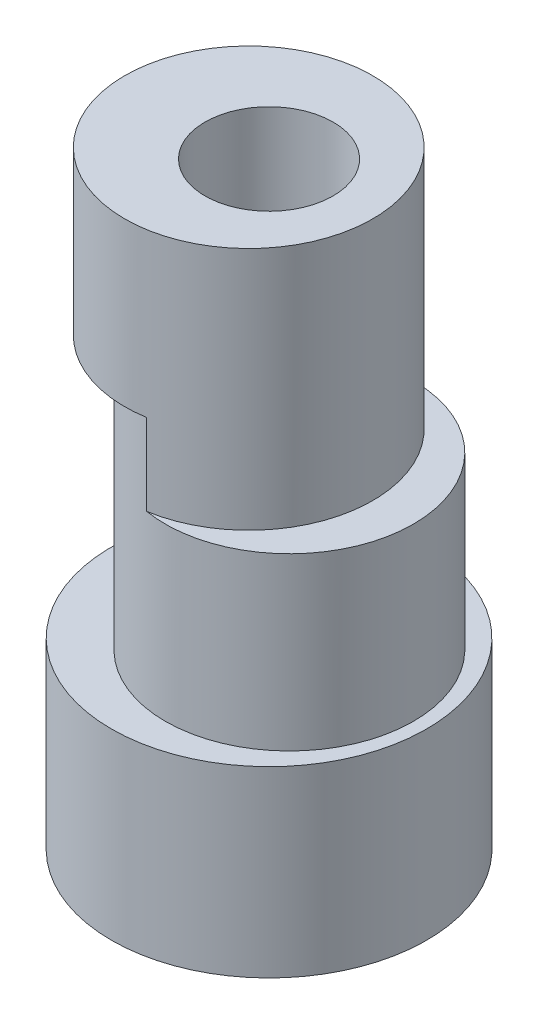
ISO-10303-21;
HEADER;
FILE_DESCRIPTION(('STEP AP214'),'2;1');
FILE_NAME('part.step','',(''),(''),'','','');
FILE_SCHEMA(('AUTOMOTIVE_DESIGN { 1 0 10303 214 1 1 1 1 }'));
ENDSEC;
DATA;
#1=APPLICATION_CONTEXT('core data for automotive mechanical design processes');
#2=APPLICATION_PROTOCOL_DEFINITION('international standard','automotive_design',2000,#1);
#3=PRODUCT_CONTEXT('',#1,'mechanical');
#4=PRODUCT('Part','Part','',(#3));
#5=PRODUCT_RELATED_PRODUCT_CATEGORY('part','',(#4));
#6=PRODUCT_DEFINITION_FORMATION('','',#4);
#7=PRODUCT_DEFINITION_CONTEXT('part definition',#1,'design');
#8=PRODUCT_DEFINITION('design','',#6,#7);
#9=PRODUCT_DEFINITION_SHAPE('','',#8);
#10=(LENGTH_UNIT() NAMED_UNIT(*) SI_UNIT(.MILLI.,.METRE.));
#11=(NAMED_UNIT(*) PLANE_ANGLE_UNIT() SI_UNIT($,.RADIAN.));
#12=(NAMED_UNIT(*) SI_UNIT($,.STERADIAN.) SOLID_ANGLE_UNIT());
#13=UNCERTAINTY_MEASURE_WITH_UNIT(LENGTH_MEASURE(1.E-05),#10,'distance_accuracy_value','');
#14=(GEOMETRIC_REPRESENTATION_CONTEXT(3) GLOBAL_UNCERTAINTY_ASSIGNED_CONTEXT((#13)) GLOBAL_UNIT_ASSIGNED_CONTEXT((#10,
#11,#12)) REPRESENTATION_CONTEXT('',''));
#15=CARTESIAN_POINT('',(0.,0.,0.));
#16=DIRECTION('',(0.,0.,1.));
#17=DIRECTION('',(1.,0.,0.));
#18=AXIS2_PLACEMENT_3D('',#15,#16,#17);
#19=CARTESIAN_POINT('',(-7.75,5.5,0.));
#20=DIRECTION('',(1.,0.,0.));
#21=DIRECTION('',(0.,0.,-1.));
#22=AXIS2_PLACEMENT_3D('',#19,#20,#21);
#23=CYLINDRICAL_SURFACE('',#22,1.5);
#24=CARTESIAN_POINT('',(-7.75,4.,0.));
#25=CARTESIAN_POINT('',(-7.74999847408196,4.00000313268231,-0.0834210787139819));
#26=CARTESIAN_POINT('',(-7.74863921449565,4.00698259134368,-0.166882359307396));
#27=CARTESIAN_POINT('',(-7.74334791734644,4.03469604662711,-0.331449592125704));
#28=CARTESIAN_POINT('',(-7.73941376913806,4.05544132733654,-0.412553555037757));
#29=CARTESIAN_POINT('',(-7.72941240772484,4.11002461966262,-0.570002657544576));
#30=CARTESIAN_POINT('',(-7.7233471771437,4.14385046488491,-0.64635214294661));
#31=CARTESIAN_POINT('',(-7.70974455178129,4.22359938098148,-0.792285992836983));
#32=CARTESIAN_POINT('',(-7.70220726111347,4.26952159640356,-0.861870835242917));
#33=CARTESIAN_POINT('',(-7.6863840905269,4.37277953275531,-0.993191675954351));
#34=CARTESIAN_POINT('',(-7.67809065789604,4.43023936977716,-1.05482918133122));
#35=CARTESIAN_POINT('',(-7.66174545065496,4.5546745695062,-1.16765325234664));
#36=CARTESIAN_POINT('',(-7.65369369415063,4.62165064300631,-1.2188390366218));
#37=CARTESIAN_POINT('',(-7.63866991902306,4.76391909131572,-1.30972091001982));
#38=CARTESIAN_POINT('',(-7.63170762900968,4.83927713328043,-1.3493159525154));
#39=CARTESIAN_POINT('',(-7.61975791069809,4.99573312434035,-1.41524529666488));
#40=CARTESIAN_POINT('',(-7.6147703003598,5.07683054352593,-1.44158082073674));
#41=CARTESIAN_POINT('',(-7.60741086759107,5.2414065627842,-1.47992571756973));
#42=CARTESIAN_POINT('',(-7.60500761838759,5.32484359253925,-1.49210735695917));
#43=CARTESIAN_POINT('',(-7.60299433869807,5.49260914317183,-1.50233357526115));
#44=CARTESIAN_POINT('',(-7.60338404106004,5.57693757801401,-1.50037950628534));
#45=CARTESIAN_POINT('',(-7.60688404856427,5.74283827920022,-1.48252926887088));
#46=CARTESIAN_POINT('',(-7.60995597992223,5.82443263325195,-1.46682974359291));
#47=CARTESIAN_POINT('',(-7.61841397136506,5.98380703500602,-1.42224426701012));
#48=CARTESIAN_POINT('',(-7.62380013560523,6.06158691085687,-1.39335772220132));
#49=CARTESIAN_POINT('',(-7.63631940233068,6.21169570851465,-1.32302804854628));
#50=CARTESIAN_POINT('',(-7.64346339941792,6.2839868086337,-1.28150621416483));
#51=CARTESIAN_POINT('',(-7.65868628007988,6.42064946100456,-1.18714021425914));
#52=CARTESIAN_POINT('',(-7.66676526448826,6.4850201575334,-1.13429482702252));
#53=CARTESIAN_POINT('',(-7.68311457012869,6.60515020881271,-1.01772509823794));
#54=CARTESIAN_POINT('',(-7.6913858240859,6.66074652086933,-0.953832732873424));
#55=CARTESIAN_POINT('',(-7.70706304694415,6.76045723589527,-0.817543107605094));
#56=CARTESIAN_POINT('',(-7.71446900605523,6.8045715089638,-0.745145751494432));
#57=CARTESIAN_POINT('',(-7.72759765137465,6.88009284102279,-0.593725914754121));
#58=CARTESIAN_POINT('',(-7.73331798232966,6.91148214275484,-0.514694360575272));
#59=CARTESIAN_POINT('',(-7.74241280644494,6.96049338712995,-0.352344598280828));
#60=CARTESIAN_POINT('',(-7.74578756541723,6.97811688981069,-0.269026877044974));
#61=CARTESIAN_POINT('',(-7.74977424845929,6.99886747844731,-0.101871802484301));
#62=CARTESIAN_POINT('',(-7.75042872018128,7.00221782981256,-0.0180631478958446));
#63=CARTESIAN_POINT('',(-7.74901892693282,6.99492703916325,0.148916632529927));
#64=CARTESIAN_POINT('',(-7.74695480467765,6.98428663160754,0.23208779160267));
#65=CARTESIAN_POINT('',(-7.7403663072359,6.94950192764545,0.394717725412862));
#66=CARTESIAN_POINT('',(-7.73586266070818,6.92547135890025,0.474201738407224));
#67=CARTESIAN_POINT('',(-7.72489811710861,6.8647121166184,0.628012475405679));
#68=CARTESIAN_POINT('',(-7.71843708048053,6.82798253765271,0.702338831219205));
#69=CARTESIAN_POINT('',(-7.7041683619824,6.74237905772412,0.844671894023758));
#70=CARTESIAN_POINT('',(-7.69634597748223,6.69336968781137,0.912595621279698));
#71=CARTESIAN_POINT('',(-7.68025855618537,6.58478021538908,1.03933496632102));
#72=CARTESIAN_POINT('',(-7.67199347520694,6.52519905642197,1.09814967272472));
#73=CARTESIAN_POINT('',(-7.65580995071658,6.39614381719799,1.20585617272696));
#74=CARTESIAN_POINT('',(-7.64789809799975,6.32654124358649,1.25459516224029));
#75=CARTESIAN_POINT('',(-7.63345275472628,6.18000576141992,1.33969011925474));
#76=CARTESIAN_POINT('',(-7.62691921097647,6.10307313592041,1.37604656466947));
#77=CARTESIAN_POINT('',(-7.61602267841533,5.94443709141718,1.43513157210702));
#78=CARTESIAN_POINT('',(-7.61164885180106,5.8627598406082,1.45792829947187));
#79=CARTESIAN_POINT('',(-7.60554305407608,5.69664116073561,1.48945537425568));
#80=CARTESIAN_POINT('',(-7.60381076295927,5.61220006776103,1.49818742553264));
#81=CARTESIAN_POINT('',(-7.60320113886837,5.4444829476079,1.50127736967434));
#82=CARTESIAN_POINT('',(-7.60427589307599,5.36121144422073,1.49587649128859));
#83=CARTESIAN_POINT('',(-7.60905263452398,5.19678756933644,1.47138405136503));
#84=CARTESIAN_POINT('',(-7.61275460356229,5.11563518316155,1.45229258467931));
#85=CARTESIAN_POINT('',(-7.62234788207545,4.95789423128806,1.40106548612556));
#86=CARTESIAN_POINT('',(-7.62823452797357,4.88129634442607,1.36895762664975));
#87=CARTESIAN_POINT('',(-7.64153687010842,4.73453656211829,1.29263615483108));
#88=CARTESIAN_POINT('',(-7.64895268405886,4.66437516274748,1.24842161044272));
#89=CARTESIAN_POINT('',(-7.66462550473274,4.53127502094128,1.14831022070382));
#90=CARTESIAN_POINT('',(-7.67289403231619,4.46846917952908,1.09223845338799));
#91=CARTESIAN_POINT('',(-7.68925611889744,4.35307786661671,0.970367356758541));
#92=CARTESIAN_POINT('',(-7.69734963727052,4.30049474594495,0.904565796081145));
#93=CARTESIAN_POINT('',(-7.71254202408635,4.20656295006088,0.764337841919684));
#94=CARTESIAN_POINT('',(-7.71963049375684,4.16532808104767,0.689834048073538));
#95=CARTESIAN_POINT('',(-7.73191220790458,4.09602775902319,0.534840677982818));
#96=CARTESIAN_POINT('',(-7.73710719743173,4.06795017327669,0.454356695930213));
#97=CARTESIAN_POINT('',(-7.74398117253215,4.03133747033662,0.311385193383974));
#98=CARTESIAN_POINT('',(-7.74622526720601,4.01960641323065,0.249723311606212));
#99=CARTESIAN_POINT('',(-7.74923523343163,4.00393661131544,0.125381838034376));
#100=CARTESIAN_POINT('',(-7.75000114693474,3.9999976453636,0.0627022751733915));
#101=CARTESIAN_POINT('',(-7.75,4.,0.));
#102=B_SPLINE_CURVE_WITH_KNOTS('',3,(#24,#25,#26,#27,#28,#29,#30,#31,#32,#33,#34,#35,#36,#37,
#38,#39,#40,#41,#42,#43,#44,#45,#46,#47,#48,#49,#50,#51,#52,#53,#54,#55,#56,#57,#58,#59,#60,#61,
#62,#63,#64,#65,#66,#67,#68,#69,#70,#71,#72,#73,#74,#75,#76,#77,#78,#79,#80,#81,#82,#83,#84,#85,
#86,#87,#88,#89,#90,#91,#92,#93,#94,#95,#96,#97,#98,#99,#100,#101),.UNSPECIFIED.,.T.,.F.,(4,2,2,
2,2,2,2,2,2,2,2,2,2,2,2,2,2,2,2,2,2,2,2,2,2,2,2,2,2,2,2,2,2,2,2,2,2,2,4),(0.,0.250033893279061,
0.500272997362749,0.750279908627459,1.00026914421188,1.25310753798955,1.5059648268747,
1.76096497917487,2.01594161826314,2.26778131268177,2.51959691839715,2.76786784168443,
3.01614993992392,3.26601139971541,3.51589983096031,3.76999112259671,4.02408528874255,
4.27853282397684,4.53295151923209,4.78337555478589,5.03378644460482,5.28210222477901,
5.53043571331732,5.78163969279568,6.03286878968402,6.28766619193877,6.54245375898111,
6.79594942792411,7.04941438495324,7.29858139147461,7.54774667171633,7.79638309590845,
8.04503866701402,8.2976563623792,8.55033208145762,8.80545637409624,9.06034494357577,
9.24828472065447,9.4362191638521),.UNSPECIFIED.);
#103=CARTESIAN_POINT('',(-7.75,4.,0.));
#104=VERTEX_POINT('',#103);
#105=EDGE_CURVE('E141',#104,#104,#102,.T.);
#106=ORIENTED_EDGE('',*,*,#105,.F.);
#107=EDGE_LOOP('',(#106));
#108=FACE_BOUND('',#107,.T.);
#109=CARTESIAN_POINT('',(-5.5,5.5,0.));
#110=DIRECTION('',(1.,0.,0.));
#111=DIRECTION('',(0.,0.,-1.));
#112=AXIS2_PLACEMENT_3D('',#109,#110,#111);
#113=CIRCLE('',#112,1.5);
#114=CARTESIAN_POINT('',(-5.5,5.5,-1.5));
#115=VERTEX_POINT('',#114);
#116=EDGE_CURVE('E115',#115,#115,#113,.T.);
#117=ORIENTED_EDGE('',*,*,#116,.T.);
#118=EDGE_LOOP('',(#117));
#119=FACE_BOUND('',#118,.T.);
#120=ADVANCED_FACE('F33',(#108,#119),#23,.F.);
#121=CARTESIAN_POINT('',(0.,9.,0.));
#122=DIRECTION('',(0.,-1.,0.));
#123=DIRECTION('',(0.,0.,-1.));
#124=AXIS2_PLACEMENT_3D('',#121,#122,#123);
#125=CYLINDRICAL_SURFACE('',#124,7.75);
#126=ORIENTED_EDGE('',*,*,#105,.T.);
#127=EDGE_LOOP('',(#126));
#128=FACE_BOUND('',#127,.T.);
#129=CARTESIAN_POINT('',(0.,9.,0.));
#130=DIRECTION('',(0.,1.,0.));
#131=DIRECTION('',(0.,0.,1.));
#132=AXIS2_PLACEMENT_3D('',#129,#130,#131);
#133=CIRCLE('',#132,7.75);
#134=CARTESIAN_POINT('',(0.,9.,7.75));
#135=VERTEX_POINT('',#134);
#136=EDGE_CURVE('E203',#135,#135,#133,.T.);
#137=ORIENTED_EDGE('',*,*,#136,.F.);
#138=EDGE_LOOP('',(#137));
#139=FACE_BOUND('',#138,.T.);
#140=CARTESIAN_POINT('',(0.,0.,0.));
#141=DIRECTION('',(0.,1.,0.));
#142=DIRECTION('',(0.,0.,1.));
#143=AXIS2_PLACEMENT_3D('',#140,#141,#142);
#144=CIRCLE('',#143,7.75);
#145=CARTESIAN_POINT('',(0.,0.,7.75));
#146=VERTEX_POINT('',#145);
#147=EDGE_CURVE('E201',#146,#146,#144,.T.);
#148=ORIENTED_EDGE('',*,*,#147,.T.);
#149=EDGE_LOOP('',(#148));
#150=FACE_BOUND('',#149,.T.);
#151=ADVANCED_FACE('F35',(#128,#139,#150),#125,.T.);
#152=CARTESIAN_POINT('',(0.,9.,0.));
#153=DIRECTION('',(0.,1.,0.));
#154=DIRECTION('',(0.,0.,1.));
#155=AXIS2_PLACEMENT_3D('',#152,#153,#154);
#156=PLANE('',#155);
#157=CARTESIAN_POINT('',(1.,9.,0.));
#158=DIRECTION('',(0.,1.,0.));
#159=DIRECTION('',(0.,0.,1.));
#160=AXIS2_PLACEMENT_3D('',#157,#158,#159);
#161=CIRCLE('',#160,6.1);
#162=CARTESIAN_POINT('',(1.,9.,6.1));
#163=VERTEX_POINT('',#162);
#164=EDGE_CURVE('E206',#163,#163,#161,.T.);
#165=ORIENTED_EDGE('',*,*,#164,.F.);
#166=EDGE_LOOP('',(#165));
#167=FACE_BOUND('',#166,.T.);
#168=ORIENTED_EDGE('',*,*,#136,.T.);
#169=EDGE_LOOP('',(#168));
#170=FACE_BOUND('',#169,.T.);
#171=ADVANCED_FACE('F189',(#167,#170),#156,.T.);
#172=CARTESIAN_POINT('',(0.,0.,0.));
#173=DIRECTION('',(0.,1.,0.));
#174=DIRECTION('',(0.,0.,1.));
#175=AXIS2_PLACEMENT_3D('',#172,#173,#174);
#176=PLANE('',#175);
#177=CARTESIAN_POINT('',(0.,0.,0.));
#178=DIRECTION('',(0.,-1.,0.));
#179=DIRECTION('',(0.,0.,-1.));
#180=AXIS2_PLACEMENT_3D('',#177,#178,#179);
#181=CIRCLE('',#180,3.15);
#182=CARTESIAN_POINT('',(0.,0.,-3.15));
#183=VERTEX_POINT('',#182);
#184=EDGE_CURVE('E161',#183,#183,#181,.T.);
#185=ORIENTED_EDGE('',*,*,#184,.F.);
#186=EDGE_LOOP('',(#185));
#187=FACE_BOUND('',#186,.T.);
#188=ORIENTED_EDGE('',*,*,#147,.F.);
#189=EDGE_LOOP('',(#188));
#190=FACE_BOUND('',#189,.T.);
#191=ADVANCED_FACE('F188',(#187,#190),#176,.F.);
#192=CARTESIAN_POINT('',(1.,21.4,0.));
#193=DIRECTION('',(0.,-1.,0.));
#194=DIRECTION('',(0.,0.,-1.));
#195=AXIS2_PLACEMENT_3D('',#192,#193,#194);
#196=CYLINDRICAL_SURFACE('',#195,6.1);
#197=CARTESIAN_POINT('',(1.,21.4,0.));
#198=DIRECTION('',(0.,1.,0.));
#199=DIRECTION('',(0.,0.,1.));
#200=AXIS2_PLACEMENT_3D('',#197,#198,#199);
#201=CIRCLE('',#200,6.1);
#202=CARTESIAN_POINT('',(0.,21.4,-6.01747455333215));
#203=VERTEX_POINT('',#202);
#204=CARTESIAN_POINT('',(0.,21.4,6.01747455333215));
#205=VERTEX_POINT('',#204);
#206=EDGE_CURVE('E112',#203,#205,#201,.T.);
#207=ORIENTED_EDGE('',*,*,#206,.F.);
#208=DIRECTION('',(0.,1.,0.));
#209=VECTOR('',#208,1.);
#210=CARTESIAN_POINT('',(0.,17.4,-6.01747455333215));
#211=LINE('',#210,#209);
#212=CARTESIAN_POINT('',(0.,17.4,-6.01747455333215));
#213=VERTEX_POINT('',#212);
#214=EDGE_CURVE('E57',#213,#203,#211,.T.);
#215=ORIENTED_EDGE('',*,*,#214,.F.);
#216=CARTESIAN_POINT('',(1.,17.4,0.));
#217=DIRECTION('',(0.,1.,0.));
#218=DIRECTION('',(0.,0.,1.));
#219=AXIS2_PLACEMENT_3D('',#216,#217,#218);
#220=CIRCLE('',#219,6.1);
#221=CARTESIAN_POINT('',(0.,17.4,6.01747455333215));
#222=VERTEX_POINT('',#221);
#223=EDGE_CURVE('E101',#222,#213,#220,.T.);
#224=ORIENTED_EDGE('',*,*,#223,.F.);
#225=DIRECTION('',(0.,1.,0.));
#226=VECTOR('',#225,1.);
#227=CARTESIAN_POINT('',(0.,17.4,6.01747455333215));
#228=LINE('',#227,#226);
#229=EDGE_CURVE('E107',#222,#205,#228,.T.);
#230=ORIENTED_EDGE('',*,*,#229,.T.);
#231=EDGE_LOOP('',(#207,#215,#224,#230));
#232=FACE_BOUND('',#231,.T.);
#233=ORIENTED_EDGE('',*,*,#164,.T.);
#234=EDGE_LOOP('',(#233));
#235=FACE_BOUND('',#234,.T.);
#236=ADVANCED_FACE('F109',(#232,#235),#196,.T.);
#237=CARTESIAN_POINT('',(-1.,21.4,0.));
#238=DIRECTION('',(0.,1.,0.));
#239=DIRECTION('',(0.,0.,1.));
#240=AXIS2_PLACEMENT_3D('',#237,#238,#239);
#241=PLANE('',#240);
#242=CARTESIAN_POINT('',(-1.,21.4,0.));
#243=DIRECTION('',(0.,1.,0.));
#244=DIRECTION('',(0.,0.,1.));
#245=AXIS2_PLACEMENT_3D('',#242,#243,#244);
#246=CIRCLE('',#245,6.1);
#247=EDGE_CURVE('E371',#203,#205,#246,.T.);
#248=ORIENTED_EDGE('',*,*,#247,.F.);
#249=ORIENTED_EDGE('',*,*,#206,.T.);
#250=EDGE_LOOP('',(#248,#249));
#251=FACE_BOUND('',#250,.T.);
#252=ADVANCED_FACE('F179',(#251),#241,.F.);
#253=CARTESIAN_POINT('',(-1.,29.4,0.));
#254=DIRECTION('',(0.,-1.,0.));
#255=DIRECTION('',(0.,0.,-1.));
#256=AXIS2_PLACEMENT_3D('',#253,#254,#255);
#257=CYLINDRICAL_SURFACE('',#256,6.1);
#258=CARTESIAN_POINT('',(-1.,29.4,0.));
#259=DIRECTION('',(0.,1.,0.));
#260=DIRECTION('',(0.,0.,1.));
#261=AXIS2_PLACEMENT_3D('',#258,#259,#260);
#262=CIRCLE('',#261,6.1);
#263=CARTESIAN_POINT('',(-1.,29.4,6.1));
#264=VERTEX_POINT('',#263);
#265=EDGE_CURVE('E208',#264,#264,#262,.T.);
#266=ORIENTED_EDGE('',*,*,#265,.F.);
#267=EDGE_LOOP('',(#266));
#268=FACE_BOUND('',#267,.T.);
#269=ORIENTED_EDGE('',*,*,#247,.T.);
#270=ORIENTED_EDGE('',*,*,#229,.F.);
#271=CARTESIAN_POINT('',(-1.,17.4,0.));
#272=DIRECTION('',(0.,-1.,0.));
#273=DIRECTION('',(0.,0.,1.));
#274=AXIS2_PLACEMENT_3D('',#271,#272,#273);
#275=CIRCLE('',#274,6.1);
#276=EDGE_CURVE('E103',#213,#222,#275,.T.);
#277=ORIENTED_EDGE('',*,*,#276,.F.);
#278=ORIENTED_EDGE('',*,*,#214,.T.);
#279=EDGE_LOOP('',(#269,#270,#277,#278));
#280=FACE_BOUND('',#279,.T.);
#281=ADVANCED_FACE('F106',(#268,#280),#257,.T.);
#282=CARTESIAN_POINT('',(-1.,29.4,0.));
#283=DIRECTION('',(0.,1.,0.));
#284=DIRECTION('',(0.,0.,1.));
#285=AXIS2_PLACEMENT_3D('',#282,#283,#284);
#286=PLANE('',#285);
#287=CARTESIAN_POINT('',(0.,29.4,0.));
#288=DIRECTION('',(0.,-1.,0.));
#289=DIRECTION('',(0.,0.,-1.));
#290=AXIS2_PLACEMENT_3D('',#287,#288,#289);
#291=CIRCLE('',#290,3.15);
#292=CARTESIAN_POINT('',(0.,29.4,-3.15));
#293=VERTEX_POINT('',#292);
#294=EDGE_CURVE('E162',#293,#293,#291,.T.);
#295=ORIENTED_EDGE('',*,*,#294,.T.);
#296=EDGE_LOOP('',(#295));
#297=FACE_BOUND('',#296,.T.);
#298=ORIENTED_EDGE('',*,*,#265,.T.);
#299=EDGE_LOOP('',(#298));
#300=FACE_BOUND('',#299,.T.);
#301=ADVANCED_FACE('F174',(#297,#300),#286,.T.);
#302=CARTESIAN_POINT('',(0.,29.4,0.));
#303=DIRECTION('',(0.,-1.,0.));
#304=DIRECTION('',(0.,0.,-1.));
#305=AXIS2_PLACEMENT_3D('',#302,#303,#304);
#306=CYLINDRICAL_SURFACE('',#305,3.15);
#307=CARTESIAN_POINT('',(0.,8.67542648054294,0.));
#308=DIRECTION('',(0.,0.866025403784438,0.500000000000001));
#309=DIRECTION('',(0.,-0.500000000000001,0.866025403784438));
#310=AXIS2_PLACEMENT_3D('',#307,#308,#309);
#311=ELLIPSE('',#310,3.63730669589464,3.15);
#312=CARTESIAN_POINT('',(-1.53622914957372,7.08771324027147,2.75));
#313=VERTEX_POINT('',#312);
#314=CARTESIAN_POINT('',(-3.15,8.67542648054294,0.));
#315=VERTEX_POINT('',#314);
#316=EDGE_CURVE('E212',#313,#315,#311,.F.);
#317=ORIENTED_EDGE('',*,*,#316,.T.);
#318=CARTESIAN_POINT('',(0.,8.67542648054294,0.));
#319=DIRECTION('',(0.,0.866025403784438,-0.5));
#320=DIRECTION('',(0.,-0.5,-0.866025403784439));
#321=AXIS2_PLACEMENT_3D('',#318,#319,#320);
#322=ELLIPSE('',#321,3.63730669589464,3.15);
#323=CARTESIAN_POINT('',(-1.53622914957372,7.08771324027147,-2.75));
#324=VERTEX_POINT('',#323);
#325=EDGE_CURVE('E11',#315,#324,#322,.F.);
#326=ORIENTED_EDGE('',*,*,#325,.T.);
#327=DIRECTION('',(0.,-1.,0.));
#328=VECTOR('',#327,1.);
#329=CARTESIAN_POINT('',(-1.53622914957372,29.4,-2.75));
#330=LINE('',#329,#328);
#331=CARTESIAN_POINT('',(-1.53622914957372,3.91228675972853,-2.75));
#332=VERTEX_POINT('',#331);
#333=EDGE_CURVE('E42',#324,#332,#330,.T.);
#334=ORIENTED_EDGE('',*,*,#333,.T.);
#335=CARTESIAN_POINT('',(0.,2.32457351945706,0.));
#336=DIRECTION('',(0.,-0.866025403784438,-0.5));
#337=DIRECTION('',(0.,-0.5,0.866025403784438));
#338=AXIS2_PLACEMENT_3D('',#335,#336,#337);
#339=ELLIPSE('',#338,3.63730669589464,3.15);
#340=CARTESIAN_POINT('',(-3.15,2.32457351945706,0.));
#341=VERTEX_POINT('',#340);
#342=EDGE_CURVE('E221',#332,#341,#339,.F.);
#343=ORIENTED_EDGE('',*,*,#342,.T.);
#344=CARTESIAN_POINT('',(0.,2.32457351945705,0.));
#345=DIRECTION('',(0.,-0.866025403784439,0.5));
#346=DIRECTION('',(0.,-0.5,-0.866025403784439));
#347=AXIS2_PLACEMENT_3D('',#344,#345,#346);
#348=ELLIPSE('',#347,3.63730669589464,3.15);
#349=CARTESIAN_POINT('',(-1.53622914957372,3.91228675972853,2.75));
#350=VERTEX_POINT('',#349);
#351=EDGE_CURVE('E218',#341,#350,#348,.F.);
#352=ORIENTED_EDGE('',*,*,#351,.T.);
#353=DIRECTION('',(0.,-1.,0.));
#354=VECTOR('',#353,1.);
#355=CARTESIAN_POINT('',(-1.53622914957372,29.4,2.75));
#356=LINE('',#355,#354);
#357=EDGE_CURVE('E215',#350,#313,#356,.F.);
#358=ORIENTED_EDGE('',*,*,#357,.T.);
#359=EDGE_LOOP('',(#317,#326,#334,#343,#352,#358));
#360=FACE_BOUND('',#359,.T.);
#361=ORIENTED_EDGE('',*,*,#294,.F.);
#362=EDGE_LOOP('',(#361));
#363=FACE_BOUND('',#362,.T.);
#364=ORIENTED_EDGE('',*,*,#184,.T.);
#365=EDGE_LOOP('',(#364));
#366=FACE_BOUND('',#365,.T.);
#367=ADVANCED_FACE('F171',(#360,#363,#366),#306,.F.);
#368=CARTESIAN_POINT('',(-5.5,7.08771324027147,-2.75));
#369=DIRECTION('',(0.,0.866025403784438,-0.5));
#370=DIRECTION('',(0.,0.5,0.866025403784439));
#371=AXIS2_PLACEMENT_3D('',#368,#369,#370);
#372=PLANE('',#371);
#373=DIRECTION('',(1.,0.,0.));
#374=VECTOR('',#373,1.);
#375=CARTESIAN_POINT('',(-5.5,8.67542648054294,0.));
#376=LINE('',#375,#374);
#377=CARTESIAN_POINT('',(-5.5,8.67542648054294,0.));
#378=VERTEX_POINT('',#377);
#379=EDGE_CURVE('E49',#378,#315,#376,.T.);
#380=ORIENTED_EDGE('',*,*,#379,.F.);
#381=DIRECTION('',(0.,0.5,0.866025403784439));
#382=VECTOR('',#381,1.);
#383=CARTESIAN_POINT('',(-5.5,7.08771324027147,-2.75));
#384=LINE('',#383,#382);
#385=CARTESIAN_POINT('',(-5.5,7.08771324027147,-2.75));
#386=VERTEX_POINT('',#385);
#387=EDGE_CURVE('E120',#386,#378,#384,.T.);
#388=ORIENTED_EDGE('',*,*,#387,.F.);
#389=DIRECTION('',(1.,0.,0.));
#390=VECTOR('',#389,1.);
#391=CARTESIAN_POINT('',(-5.5,7.08771324027147,-2.75));
#392=LINE('',#391,#390);
#393=EDGE_CURVE('E138',#386,#324,#392,.T.);
#394=ORIENTED_EDGE('',*,*,#393,.T.);
#395=ORIENTED_EDGE('',*,*,#325,.F.);
#396=EDGE_LOOP('',(#380,#388,#394,#395));
#397=FACE_BOUND('',#396,.T.);
#398=ADVANCED_FACE('F169',(#397),#372,.F.);
#399=CARTESIAN_POINT('',(-5.5,3.91228675972853,-2.75));
#400=DIRECTION('',(0.,0.,-1.));
#401=DIRECTION('',(-1.,0.,0.));
#402=AXIS2_PLACEMENT_3D('',#399,#400,#401);
#403=PLANE('',#402);
#404=ORIENTED_EDGE('',*,*,#393,.F.);
#405=DIRECTION('',(0.,1.,0.));
#406=VECTOR('',#405,1.);
#407=CARTESIAN_POINT('',(-5.5,3.91228675972853,-2.75));
#408=LINE('',#407,#406);
#409=CARTESIAN_POINT('',(-5.5,3.91228675972853,-2.75));
#410=VERTEX_POINT('',#409);
#411=EDGE_CURVE('E135',#410,#386,#408,.T.);
#412=ORIENTED_EDGE('',*,*,#411,.F.);
#413=DIRECTION('',(1.,0.,0.));
#414=VECTOR('',#413,1.);
#415=CARTESIAN_POINT('',(-5.5,3.91228675972853,-2.75));
#416=LINE('',#415,#414);
#417=EDGE_CURVE('E142',#410,#332,#416,.T.);
#418=ORIENTED_EDGE('',*,*,#417,.T.);
#419=ORIENTED_EDGE('',*,*,#333,.F.);
#420=EDGE_LOOP('',(#404,#412,#418,#419));
#421=FACE_BOUND('',#420,.T.);
#422=ADVANCED_FACE('F226',(#421),#403,.F.);
#423=CARTESIAN_POINT('',(-5.5,2.32457351945706,0.));
#424=DIRECTION('',(0.,-0.866025403784438,-0.5));
#425=DIRECTION('',(0.,0.5,-0.866025403784438));
#426=AXIS2_PLACEMENT_3D('',#423,#424,#425);
#427=PLANE('',#426);
#428=ORIENTED_EDGE('',*,*,#417,.F.);
#429=DIRECTION('',(0.,0.5,-0.866025403784438));
#430=VECTOR('',#429,1.);
#431=CARTESIAN_POINT('',(-5.5,2.32457351945706,0.));
#432=LINE('',#431,#430);
#433=CARTESIAN_POINT('',(-5.5,2.32457351945706,0.));
#434=VERTEX_POINT('',#433);
#435=EDGE_CURVE('E132',#434,#410,#432,.T.);
#436=ORIENTED_EDGE('',*,*,#435,.F.);
#437=DIRECTION('',(1.,0.,0.));
#438=VECTOR('',#437,1.);
#439=CARTESIAN_POINT('',(-5.5,2.32457351945706,0.));
#440=LINE('',#439,#438);
#441=EDGE_CURVE('E145',#434,#341,#440,.T.);
#442=ORIENTED_EDGE('',*,*,#441,.T.);
#443=ORIENTED_EDGE('',*,*,#342,.F.);
#444=EDGE_LOOP('',(#428,#436,#442,#443));
#445=FACE_BOUND('',#444,.T.);
#446=ADVANCED_FACE('F235',(#445),#427,.F.);
#447=CARTESIAN_POINT('',(-5.5,3.91228675972853,2.75));
#448=DIRECTION('',(0.,-0.866025403784439,0.5));
#449=DIRECTION('',(0.,-0.5,-0.866025403784439));
#450=AXIS2_PLACEMENT_3D('',#447,#448,#449);
#451=PLANE('',#450);
#452=ORIENTED_EDGE('',*,*,#441,.F.);
#453=DIRECTION('',(0.,-0.5,-0.866025403784438));
#454=VECTOR('',#453,1.);
#455=CARTESIAN_POINT('',(-5.5,3.91228675972853,2.75));
#456=LINE('',#455,#454);
#457=CARTESIAN_POINT('',(-5.5,3.91228675972853,2.75));
#458=VERTEX_POINT('',#457);
#459=EDGE_CURVE('E129',#458,#434,#456,.T.);
#460=ORIENTED_EDGE('',*,*,#459,.F.);
#461=DIRECTION('',(1.,0.,0.));
#462=VECTOR('',#461,1.);
#463=CARTESIAN_POINT('',(-5.5,3.91228675972853,2.75));
#464=LINE('',#463,#462);
#465=EDGE_CURVE('E148',#458,#350,#464,.T.);
#466=ORIENTED_EDGE('',*,*,#465,.T.);
#467=ORIENTED_EDGE('',*,*,#351,.F.);
#468=EDGE_LOOP('',(#452,#460,#466,#467));
#469=FACE_BOUND('',#468,.T.);
#470=ADVANCED_FACE('F237',(#469),#451,.F.);
#471=CARTESIAN_POINT('',(-5.5,7.08771324027147,2.75));
#472=DIRECTION('',(0.,0.,1.));
#473=DIRECTION('',(1.,0.,0.));
#474=AXIS2_PLACEMENT_3D('',#471,#472,#473);
#475=PLANE('',#474);
#476=ORIENTED_EDGE('',*,*,#465,.F.);
#477=DIRECTION('',(0.,-1.,0.));
#478=VECTOR('',#477,1.);
#479=CARTESIAN_POINT('',(-5.5,7.08771324027147,2.75));
#480=LINE('',#479,#478);
#481=CARTESIAN_POINT('',(-5.5,7.08771324027147,2.75));
#482=VERTEX_POINT('',#481);
#483=EDGE_CURVE('E126',#482,#458,#480,.T.);
#484=ORIENTED_EDGE('',*,*,#483,.F.);
#485=DIRECTION('',(1.,0.,0.));
#486=VECTOR('',#485,1.);
#487=CARTESIAN_POINT('',(-5.5,7.08771324027147,2.75));
#488=LINE('',#487,#486);
#489=EDGE_CURVE('E151',#482,#313,#488,.T.);
#490=ORIENTED_EDGE('',*,*,#489,.T.);
#491=ORIENTED_EDGE('',*,*,#357,.F.);
#492=EDGE_LOOP('',(#476,#484,#490,#491));
#493=FACE_BOUND('',#492,.T.);
#494=ADVANCED_FACE('F239',(#493),#475,.F.);
#495=CARTESIAN_POINT('',(-5.5,8.67542648054294,0.));
#496=DIRECTION('',(0.,0.866025403784438,0.500000000000001));
#497=DIRECTION('',(0.,-0.500000000000001,0.866025403784438));
#498=AXIS2_PLACEMENT_3D('',#495,#496,#497);
#499=PLANE('',#498);
#500=ORIENTED_EDGE('',*,*,#489,.F.);
#501=DIRECTION('',(0.,-0.500000000000001,0.866025403784438));
#502=VECTOR('',#501,1.);
#503=CARTESIAN_POINT('',(-5.5,8.67542648054294,0.));
#504=LINE('',#503,#502);
#505=EDGE_CURVE('E123',#378,#482,#504,.T.);
#506=ORIENTED_EDGE('',*,*,#505,.F.);
#507=ORIENTED_EDGE('',*,*,#379,.T.);
#508=ORIENTED_EDGE('',*,*,#316,.F.);
#509=EDGE_LOOP('',(#500,#506,#507,#508));
#510=FACE_BOUND('',#509,.T.);
#511=ADVANCED_FACE('F241',(#510),#499,.F.);
#512=CARTESIAN_POINT('',(-5.5,0.,0.));
#513=DIRECTION('',(1.,0.,0.));
#514=DIRECTION('',(0.,0.,-1.));
#515=AXIS2_PLACEMENT_3D('',#512,#513,#514);
#516=PLANE('',#515);
#517=ORIENTED_EDGE('',*,*,#116,.F.);
#518=EDGE_LOOP('',(#517));
#519=FACE_BOUND('',#518,.T.);
#520=ORIENTED_EDGE('',*,*,#387,.T.);
#521=ORIENTED_EDGE('',*,*,#505,.T.);
#522=ORIENTED_EDGE('',*,*,#483,.T.);
#523=ORIENTED_EDGE('',*,*,#459,.T.);
#524=ORIENTED_EDGE('',*,*,#435,.T.);
#525=ORIENTED_EDGE('',*,*,#411,.T.);
#526=EDGE_LOOP('',(#520,#521,#522,#523,#524,#525));
#527=FACE_BOUND('',#526,.T.);
#528=ADVANCED_FACE('F231',(#519,#527),#516,.T.);
#529=CARTESIAN_POINT('',(0.,17.4,0.));
#530=DIRECTION('',(0.,1.,0.));
#531=DIRECTION('',(0.,0.,1.));
#532=AXIS2_PLACEMENT_3D('',#529,#530,#531);
#533=PLANE('',#532);
#534=ORIENTED_EDGE('',*,*,#223,.T.);
#535=ORIENTED_EDGE('',*,*,#276,.T.);
#536=EDGE_LOOP('',(#534,#535));
#537=FACE_BOUND('',#536,.T.);
#538=ADVANCED_FACE('F102',(#537),#533,.T.);
#539=CLOSED_SHELL('',(#120,#151,#171,#191,#236,#252,#281,#301,#367,#398,#422,#446,#470,#494,
#511,#528,#538));
#540=MANIFOLD_SOLID_BREP('B2',#539);
#541=ADVANCED_BREP_SHAPE_REPRESENTATION('',(#18,#540),#14);
#542=SHAPE_DEFINITION_REPRESENTATION(#9,#541);
ENDSEC;
END-ISO-10303-21;
